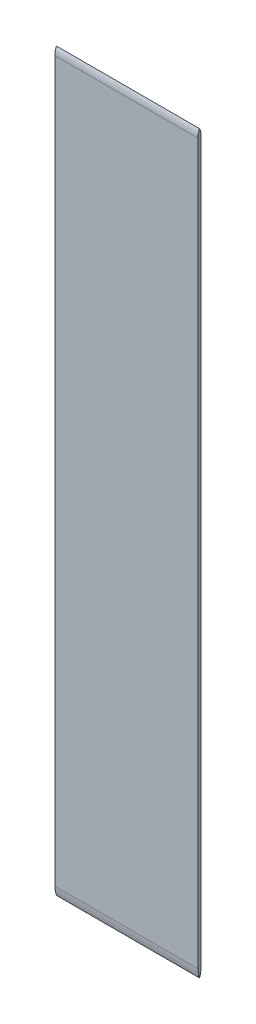
ISO-10303-21;
HEADER;
FILE_DESCRIPTION(('STEP AP214'),'2;1');
FILE_NAME('part.step','',(''),(''),'','','');
FILE_SCHEMA(('AUTOMOTIVE_DESIGN { 1 0 10303 214 1 1 1 1 }'));
ENDSEC;
DATA;
#1=APPLICATION_CONTEXT('core data for automotive mechanical design processes');
#2=APPLICATION_PROTOCOL_DEFINITION('international standard','automotive_design',2000,#1);
#3=PRODUCT_CONTEXT('',#1,'mechanical');
#4=PRODUCT('Part','Part','',(#3));
#5=PRODUCT_RELATED_PRODUCT_CATEGORY('part','',(#4));
#6=PRODUCT_DEFINITION_FORMATION('','',#4);
#7=PRODUCT_DEFINITION_CONTEXT('part definition',#1,'design');
#8=PRODUCT_DEFINITION('design','',#6,#7);
#9=PRODUCT_DEFINITION_SHAPE('','',#8);
#10=(LENGTH_UNIT() NAMED_UNIT(*) SI_UNIT(.MILLI.,.METRE.));
#11=(NAMED_UNIT(*) PLANE_ANGLE_UNIT() SI_UNIT($,.RADIAN.));
#12=(NAMED_UNIT(*) SI_UNIT($,.STERADIAN.) SOLID_ANGLE_UNIT());
#13=UNCERTAINTY_MEASURE_WITH_UNIT(LENGTH_MEASURE(1.E-05),#10,'distance_accuracy_value','');
#14=(GEOMETRIC_REPRESENTATION_CONTEXT(3) GLOBAL_UNCERTAINTY_ASSIGNED_CONTEXT((#13)) GLOBAL_UNIT_ASSIGNED_CONTEXT((#10,
#11,#12)) REPRESENTATION_CONTEXT('',''));
#15=CARTESIAN_POINT('',(0.,0.,0.));
#16=DIRECTION('',(0.,0.,1.));
#17=DIRECTION('',(1.,0.,0.));
#18=AXIS2_PLACEMENT_3D('',#15,#16,#17);
#19=CARTESIAN_POINT('',(487.500000000003,714.808216685164,35.2691453664121));
#20=CARTESIAN_POINT('',(487.500000000003,718.608234216276,35.115891622255));
#21=CARTESIAN_POINT('',(487.500000000003,721.934645222162,36.7691453664121));
#22=B_SPLINE_CURVE_WITH_KNOTS('',2,(#19,#20,#21),.UNSPECIFIED.,.F.,.F.,(3,3),(0.,1.),.UNSPECIFIED.);
#23=DIRECTION('',(-1.,0.,0.));
#24=VECTOR('',#23,1.);
#25=SURFACE_OF_LINEAR_EXTRUSION('',#22,#24);
#26=CARTESIAN_POINT('',(352.500000000003,714.808216685164,35.2691453664121));
#27=CARTESIAN_POINT('',(352.500000000003,718.608234216276,35.115891622255));
#28=CARTESIAN_POINT('',(352.500000000003,721.934645222162,36.7691453664121));
#29=B_SPLINE_CURVE_WITH_KNOTS('',2,(#26,#27,#28),.UNSPECIFIED.,.F.,.F.,(3,3),(0.,1.),.UNSPECIFIED.);
#30=CARTESIAN_POINT('',(352.500000000003,714.808216685164,35.2691453664121));
#31=VERTEX_POINT('',#30);
#32=CARTESIAN_POINT('',(352.500000000003,721.934645222162,36.7691453664121));
#33=VERTEX_POINT('',#32);
#34=EDGE_CURVE('E178',#31,#33,#29,.T.);
#35=ORIENTED_EDGE('',*,*,#34,.T.);
#36=DIRECTION('',(-1.,0.,0.));
#37=VECTOR('',#36,1.);
#38=CARTESIAN_POINT('',(487.500000000003,721.934645222162,36.7691453664121));
#39=LINE('',#38,#37);
#40=CARTESIAN_POINT('',(487.500000000003,721.934645222162,36.7691453664121));
#41=VERTEX_POINT('',#40);
#42=EDGE_CURVE('E11',#41,#33,#39,.T.);
#43=ORIENTED_EDGE('',*,*,#42,.F.);
#44=CARTESIAN_POINT('',(487.500000000003,714.808216685164,35.2691453664121));
#45=VERTEX_POINT('',#44);
#46=EDGE_CURVE('E150',#45,#41,#22,.T.);
#47=ORIENTED_EDGE('',*,*,#46,.F.);
#48=DIRECTION('',(-1.,0.,0.));
#49=VECTOR('',#48,1.);
#50=CARTESIAN_POINT('',(487.500000000003,714.808216685164,35.2691453664121));
#51=LINE('',#50,#49);
#52=EDGE_CURVE('E120',#45,#31,#51,.T.);
#53=ORIENTED_EDGE('',*,*,#52,.T.);
#54=EDGE_LOOP('',(#35,#43,#47,#53));
#55=FACE_BOUND('',#54,.T.);
#56=ADVANCED_FACE('F39',(#55),#25,.F.);
#57=CARTESIAN_POINT('',(487.500000000003,721.934645222162,36.7691453664121));
#58=CARTESIAN_POINT('',(487.500000000003,718.608234216276,38.4223991105692));
#59=CARTESIAN_POINT('',(487.500000000003,714.808216685164,38.2691453664121));
#60=B_SPLINE_CURVE_WITH_KNOTS('',2,(#57,#58,#59),.UNSPECIFIED.,.F.,.F.,(3,3),(0.,1.),.UNSPECIFIED.);
#61=DIRECTION('',(-1.,0.,0.));
#62=VECTOR('',#61,1.);
#63=SURFACE_OF_LINEAR_EXTRUSION('',#60,#62);
#64=CARTESIAN_POINT('',(352.500000000003,721.934645222162,36.7691453664121));
#65=CARTESIAN_POINT('',(352.500000000003,718.608234216276,38.4223991105692));
#66=CARTESIAN_POINT('',(352.500000000003,714.808216685164,38.2691453664121));
#67=B_SPLINE_CURVE_WITH_KNOTS('',2,(#64,#65,#66),.UNSPECIFIED.,.F.,.F.,(3,3),(0.,1.),.UNSPECIFIED.);
#68=CARTESIAN_POINT('',(352.500000000003,714.808216685164,38.2691453664121));
#69=VERTEX_POINT('',#68);
#70=EDGE_CURVE('E176',#33,#69,#67,.T.);
#71=ORIENTED_EDGE('',*,*,#70,.T.);
#72=DIRECTION('',(-1.,0.,0.));
#73=VECTOR('',#72,1.);
#74=CARTESIAN_POINT('',(487.500000000003,714.808216685164,38.2691453664121));
#75=LINE('',#74,#73);
#76=CARTESIAN_POINT('',(487.500000000003,714.808216685164,38.2691453664121));
#77=VERTEX_POINT('',#76);
#78=EDGE_CURVE('E48',#77,#69,#75,.T.);
#79=ORIENTED_EDGE('',*,*,#78,.F.);
#80=EDGE_CURVE('E93',#41,#77,#60,.T.);
#81=ORIENTED_EDGE('',*,*,#80,.F.);
#82=ORIENTED_EDGE('',*,*,#42,.T.);
#83=EDGE_LOOP('',(#71,#79,#81,#82));
#84=FACE_BOUND('',#83,.T.);
#85=ADVANCED_FACE('F143',(#84),#63,.F.);
#86=CARTESIAN_POINT('',(487.500000000003,714.808216685164,38.2691453664121));
#87=DIRECTION('',(0.,0.,-1.));
#88=DIRECTION('',(-1.,0.,0.));
#89=AXIS2_PLACEMENT_3D('',#86,#87,#88);
#90=PLANE('',#89);
#91=DIRECTION('',(0.,-1.,0.));
#92=VECTOR('',#91,1.);
#93=CARTESIAN_POINT('',(352.500000000003,714.808216685164,38.2691453664121));
#94=LINE('',#93,#92);
#95=CARTESIAN_POINT('',(352.500000000003,36.4739612564158,38.2691453664121));
#96=VERTEX_POINT('',#95);
#97=EDGE_CURVE('E172',#69,#96,#94,.T.);
#98=ORIENTED_EDGE('',*,*,#97,.T.);
#99=DIRECTION('',(-1.,0.,0.));
#100=VECTOR('',#99,1.);
#101=CARTESIAN_POINT('',(487.500000000003,36.4739612564158,38.2691453664121));
#102=LINE('',#101,#100);
#103=CARTESIAN_POINT('',(487.500000000003,36.4739612564158,38.2691453664121));
#104=VERTEX_POINT('',#103);
#105=EDGE_CURVE('E115',#104,#96,#102,.T.);
#106=ORIENTED_EDGE('',*,*,#105,.F.);
#107=DIRECTION('',(0.,-1.,0.));
#108=VECTOR('',#107,1.);
#109=CARTESIAN_POINT('',(487.500000000003,714.808216685164,38.2691453664121));
#110=LINE('',#109,#108);
#111=EDGE_CURVE('E106',#77,#104,#110,.T.);
#112=ORIENTED_EDGE('',*,*,#111,.F.);
#113=ORIENTED_EDGE('',*,*,#78,.T.);
#114=EDGE_LOOP('',(#98,#106,#112,#113));
#115=FACE_BOUND('',#114,.T.);
#116=ADVANCED_FACE('F141',(#115),#90,.F.);
#117=CARTESIAN_POINT('',(487.500000000003,36.4739612564158,38.2691453664121));
#118=CARTESIAN_POINT('',(487.500000000003,32.1687045635583,38.120599335743));
#119=CARTESIAN_POINT('',(487.500000000003,28.1192674680729,36.7691453664121));
#120=B_SPLINE_CURVE_WITH_KNOTS('',2,(#117,#118,#119),.UNSPECIFIED.,.F.,.F.,(3,3),(0.,1.),.UNSPECIFIED.);
#121=DIRECTION('',(-1.,0.,0.));
#122=VECTOR('',#121,1.);
#123=SURFACE_OF_LINEAR_EXTRUSION('',#120,#122);
#124=CARTESIAN_POINT('',(352.500000000003,36.4739612564158,38.2691453664121));
#125=CARTESIAN_POINT('',(352.500000000003,32.1687045635583,38.120599335743));
#126=CARTESIAN_POINT('',(352.500000000003,28.1192674680728,36.7691453664121));
#127=B_SPLINE_CURVE_WITH_KNOTS('',2,(#124,#125,#126),.UNSPECIFIED.,.F.,.F.,(3,3),(0.,1.),.UNSPECIFIED.);
#128=CARTESIAN_POINT('',(352.500000000003,28.1192674680728,36.7691453664121));
#129=VERTEX_POINT('',#128);
#130=EDGE_CURVE('E114',#96,#129,#127,.T.);
#131=ORIENTED_EDGE('',*,*,#130,.T.);
#132=DIRECTION('',(-1.,0.,0.));
#133=VECTOR('',#132,1.);
#134=CARTESIAN_POINT('',(487.500000000003,28.1192674680729,36.7691453664121));
#135=LINE('',#134,#133);
#136=CARTESIAN_POINT('',(487.500000000003,28.1192674680729,36.7691453664121));
#137=VERTEX_POINT('',#136);
#138=EDGE_CURVE('E111',#137,#129,#135,.T.);
#139=ORIENTED_EDGE('',*,*,#138,.F.);
#140=EDGE_CURVE('E100',#104,#137,#120,.T.);
#141=ORIENTED_EDGE('',*,*,#140,.F.);
#142=ORIENTED_EDGE('',*,*,#105,.T.);
#143=EDGE_LOOP('',(#131,#139,#141,#142));
#144=FACE_BOUND('',#143,.T.);
#145=ADVANCED_FACE('F112',(#144),#123,.F.);
#146=CARTESIAN_POINT('',(487.500000000003,28.1192674680729,36.7691453664121));
#147=CARTESIAN_POINT('',(487.500000000003,32.1687045635583,35.4176913970812));
#148=CARTESIAN_POINT('',(487.500000000003,36.4739612564158,35.2691453664121));
#149=B_SPLINE_CURVE_WITH_KNOTS('',2,(#146,#147,#148),.UNSPECIFIED.,.F.,.F.,(3,3),(0.,1.),.UNSPECIFIED.);
#150=DIRECTION('',(-1.,0.,0.));
#151=VECTOR('',#150,1.);
#152=SURFACE_OF_LINEAR_EXTRUSION('',#149,#151);
#153=CARTESIAN_POINT('',(352.500000000003,28.1192674680728,36.7691453664121));
#154=CARTESIAN_POINT('',(352.500000000003,32.1687045635583,35.4176913970812));
#155=CARTESIAN_POINT('',(352.500000000003,36.4739612564158,35.2691453664121));
#156=B_SPLINE_CURVE_WITH_KNOTS('',2,(#153,#154,#155),.UNSPECIFIED.,.F.,.F.,(3,3),(0.,1.),.UNSPECIFIED.);
#157=CARTESIAN_POINT('',(352.500000000003,36.4739612564158,35.2691453664121));
#158=VERTEX_POINT('',#157);
#159=EDGE_CURVE('E79',#129,#158,#156,.T.);
#160=ORIENTED_EDGE('',*,*,#159,.T.);
#161=DIRECTION('',(-1.,0.,0.));
#162=VECTOR('',#161,1.);
#163=CARTESIAN_POINT('',(487.500000000003,36.4739612564158,35.2691453664121));
#164=LINE('',#163,#162);
#165=CARTESIAN_POINT('',(487.500000000003,36.4739612564158,35.2691453664121));
#166=VERTEX_POINT('',#165);
#167=EDGE_CURVE('E116',#166,#158,#164,.T.);
#168=ORIENTED_EDGE('',*,*,#167,.F.);
#169=EDGE_CURVE('E104',#137,#166,#149,.T.);
#170=ORIENTED_EDGE('',*,*,#169,.F.);
#171=ORIENTED_EDGE('',*,*,#138,.T.);
#172=EDGE_LOOP('',(#160,#168,#170,#171));
#173=FACE_BOUND('',#172,.T.);
#174=ADVANCED_FACE('F118',(#173),#152,.F.);
#175=CARTESIAN_POINT('',(487.500000000003,714.808216685164,35.2691453664121));
#176=DIRECTION('',(0.,0.,1.));
#177=DIRECTION('',(1.,0.,0.));
#178=AXIS2_PLACEMENT_3D('',#175,#176,#177);
#179=PLANE('',#178);
#180=DIRECTION('',(0.,1.,0.));
#181=VECTOR('',#180,1.);
#182=CARTESIAN_POINT('',(352.500000000003,714.808216685164,35.2691453664121));
#183=LINE('',#182,#181);
#184=EDGE_CURVE('E85',#158,#31,#183,.T.);
#185=ORIENTED_EDGE('',*,*,#184,.T.);
#186=ORIENTED_EDGE('',*,*,#52,.F.);
#187=DIRECTION('',(0.,1.,0.));
#188=VECTOR('',#187,1.);
#189=CARTESIAN_POINT('',(487.500000000003,714.808216685164,35.2691453664121));
#190=LINE('',#189,#188);
#191=EDGE_CURVE('E56',#166,#45,#190,.T.);
#192=ORIENTED_EDGE('',*,*,#191,.F.);
#193=ORIENTED_EDGE('',*,*,#167,.T.);
#194=EDGE_LOOP('',(#185,#186,#192,#193));
#195=FACE_BOUND('',#194,.T.);
#196=ADVANCED_FACE('F137',(#195),#179,.F.);
#197=CARTESIAN_POINT('',(487.500000000003,718.489832584969,35.5675184943336));
#198=DIRECTION('',(1.,0.,0.));
#199=DIRECTION('',(0.,0.,-1.));
#200=AXIS2_PLACEMENT_3D('',#197,#198,#199);
#201=PLANE('',#200);
#202=ORIENTED_EDGE('',*,*,#46,.T.);
#203=ORIENTED_EDGE('',*,*,#80,.T.);
#204=ORIENTED_EDGE('',*,*,#111,.T.);
#205=ORIENTED_EDGE('',*,*,#140,.T.);
#206=ORIENTED_EDGE('',*,*,#169,.T.);
#207=ORIENTED_EDGE('',*,*,#191,.T.);
#208=EDGE_LOOP('',(#202,#203,#204,#205,#206,#207));
#209=FACE_BOUND('',#208,.T.);
#210=ADVANCED_FACE('F102',(#209),#201,.T.);
#211=CARTESIAN_POINT('',(352.500000000003,718.489832584969,35.5675184943336));
#212=DIRECTION('',(1.,0.,0.));
#213=DIRECTION('',(0.,0.,-1.));
#214=AXIS2_PLACEMENT_3D('',#211,#212,#213);
#215=PLANE('',#214);
#216=ORIENTED_EDGE('',*,*,#34,.F.);
#217=ORIENTED_EDGE('',*,*,#184,.F.);
#218=ORIENTED_EDGE('',*,*,#159,.F.);
#219=ORIENTED_EDGE('',*,*,#130,.F.);
#220=ORIENTED_EDGE('',*,*,#97,.F.);
#221=ORIENTED_EDGE('',*,*,#70,.F.);
#222=EDGE_LOOP('',(#216,#217,#218,#219,#220,#221));
#223=FACE_BOUND('',#222,.T.);
#224=ADVANCED_FACE('F175',(#223),#215,.F.);
#225=CLOSED_SHELL('',(#56,#85,#116,#145,#174,#196,#210,#224));
#226=MANIFOLD_SOLID_BREP('B2',#225);
#227=ADVANCED_BREP_SHAPE_REPRESENTATION('',(#18,#226),#14);
#228=SHAPE_DEFINITION_REPRESENTATION(#9,#227);
ENDSEC;
END-ISO-10303-21;
